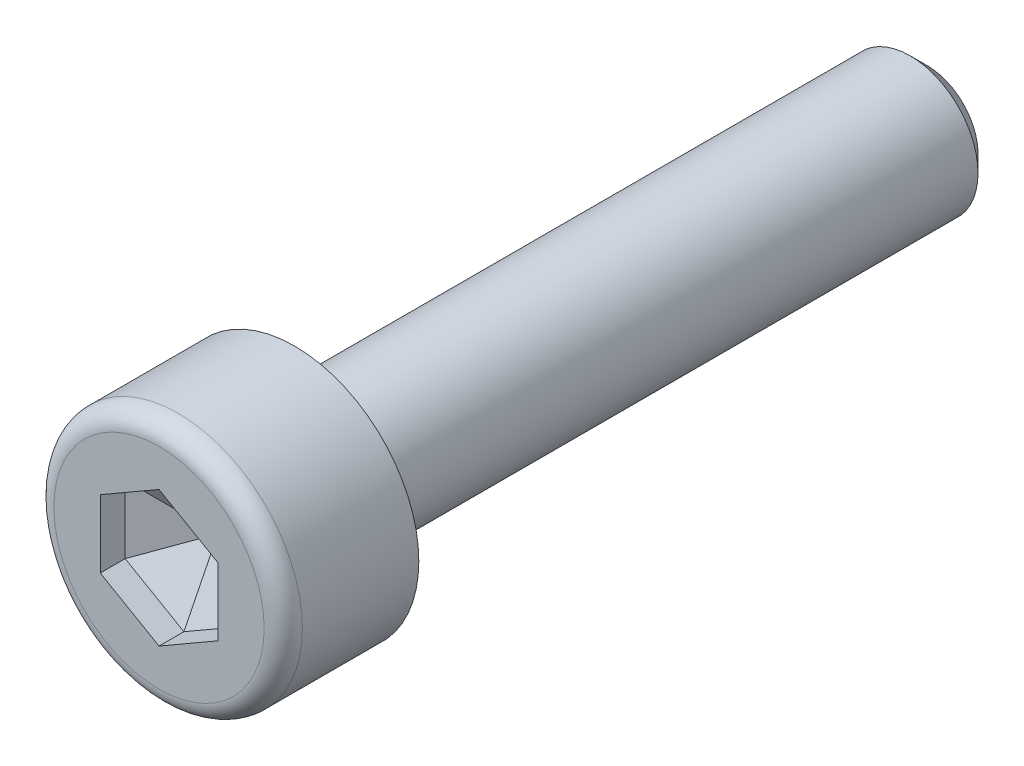
ISO-10303-21;
HEADER;
FILE_DESCRIPTION(('STEP AP214'),'2;1');
FILE_NAME('part.step','',(''),(''),'','','');
FILE_SCHEMA(('AUTOMOTIVE_DESIGN { 1 0 10303 214 1 1 1 1 }'));
ENDSEC;
DATA;
#1=APPLICATION_CONTEXT('core data for automotive mechanical design processes');
#2=APPLICATION_PROTOCOL_DEFINITION('international standard','automotive_design',2000,#1);
#3=PRODUCT_CONTEXT('',#1,'mechanical');
#4=PRODUCT('Part','Part','',(#3));
#5=PRODUCT_RELATED_PRODUCT_CATEGORY('part','',(#4));
#6=PRODUCT_DEFINITION_FORMATION('','',#4);
#7=PRODUCT_DEFINITION_CONTEXT('part definition',#1,'design');
#8=PRODUCT_DEFINITION('design','',#6,#7);
#9=PRODUCT_DEFINITION_SHAPE('','',#8);
#10=(LENGTH_UNIT() NAMED_UNIT(*) SI_UNIT(.MILLI.,.METRE.));
#11=(NAMED_UNIT(*) PLANE_ANGLE_UNIT() SI_UNIT($,.RADIAN.));
#12=(NAMED_UNIT(*) SI_UNIT($,.STERADIAN.) SOLID_ANGLE_UNIT());
#13=UNCERTAINTY_MEASURE_WITH_UNIT(LENGTH_MEASURE(1.E-05),#10,'distance_accuracy_value','');
#14=(GEOMETRIC_REPRESENTATION_CONTEXT(3) GLOBAL_UNCERTAINTY_ASSIGNED_CONTEXT((#13)) GLOBAL_UNIT_ASSIGNED_CONTEXT((#10,
#11,#12)) REPRESENTATION_CONTEXT('',''));
#15=CARTESIAN_POINT('',(0.,0.,0.));
#16=DIRECTION('',(0.,0.,1.));
#17=DIRECTION('',(1.,0.,0.));
#18=AXIS2_PLACEMENT_3D('',#15,#16,#17);
#19=CARTESIAN_POINT('',(0.,0.,0.));
#20=DIRECTION('',(0.,0.,1.));
#21=DIRECTION('',(1.,0.,0.));
#22=AXIS2_PLACEMENT_3D('',#19,#20,#21);
#23=PLANE('',#22);
#24=CARTESIAN_POINT('',(0.,0.,0.));
#25=DIRECTION('',(0.,0.,1.));
#26=DIRECTION('',(1.,0.,0.));
#27=AXIS2_PLACEMENT_3D('',#24,#25,#26);
#28=CIRCLE('',#27,1.6);
#29=CARTESIAN_POINT('',(1.6,0.,0.));
#30=VERTEX_POINT('',#29);
#31=EDGE_CURVE('E11',#30,#30,#28,.T.);
#32=ORIENTED_EDGE('',*,*,#31,.T.);
#33=EDGE_LOOP('',(#32));
#34=FACE_BOUND('',#33,.T.);
#35=CARTESIAN_POINT('',(0.,0.,0.));
#36=DIRECTION('',(0.,0.,1.));
#37=DIRECTION('',(1.,0.,0.));
#38=AXIS2_PLACEMENT_3D('',#35,#36,#37);
#39=CIRCLE('',#38,2.75);
#40=CARTESIAN_POINT('',(2.75,0.,0.));
#41=VERTEX_POINT('',#40);
#42=EDGE_CURVE('E154',#41,#41,#39,.T.);
#43=ORIENTED_EDGE('',*,*,#42,.F.);
#44=EDGE_LOOP('',(#43));
#45=FACE_BOUND('',#44,.T.);
#46=ADVANCED_FACE('F44',(#34,#45),#23,.F.);
#47=CARTESIAN_POINT('',(0.,0.,3.));
#48=DIRECTION('',(0.,0.,-1.));
#49=DIRECTION('',(-1.,0.,0.));
#50=AXIS2_PLACEMENT_3D('',#47,#48,#49);
#51=CYLINDRICAL_SURFACE('',#50,2.75);
#52=CARTESIAN_POINT('',(0.,0.,2.57692307692308));
#53=DIRECTION('',(0.,0.,1.));
#54=DIRECTION('',(1.,0.,0.));
#55=AXIS2_PLACEMENT_3D('',#52,#53,#54);
#56=CIRCLE('',#55,2.75);
#57=CARTESIAN_POINT('',(2.75,0.,2.57692307692308));
#58=VERTEX_POINT('',#57);
#59=EDGE_CURVE('E173',#58,#58,#56,.F.);
#60=ORIENTED_EDGE('',*,*,#59,.T.);
#61=EDGE_LOOP('',(#60));
#62=FACE_BOUND('',#61,.T.);
#63=ORIENTED_EDGE('',*,*,#42,.T.);
#64=EDGE_LOOP('',(#63));
#65=FACE_BOUND('',#64,.T.);
#66=ADVANCED_FACE('F235',(#62,#65),#51,.T.);
#67=CARTESIAN_POINT('',(0.,0.,3.));
#68=DIRECTION('',(0.,0.,1.));
#69=DIRECTION('',(1.,0.,0.));
#70=AXIS2_PLACEMENT_3D('',#67,#68,#69);
#71=PLANE('',#70);
#72=CARTESIAN_POINT('',(0.,0.,3.));
#73=DIRECTION('',(0.,0.,1.));
#74=DIRECTION('',(1.,0.,0.));
#75=AXIS2_PLACEMENT_3D('',#72,#73,#74);
#76=CIRCLE('',#75,2.32692307692308);
#77=CARTESIAN_POINT('',(2.32692307692308,0.,3.));
#78=VERTEX_POINT('',#77);
#79=EDGE_CURVE('E167',#78,#78,#76,.T.);
#80=ORIENTED_EDGE('',*,*,#79,.T.);
#81=EDGE_LOOP('',(#80));
#82=FACE_BOUND('',#81,.T.);
#83=DIRECTION('',(0.,1.,0.));
#84=VECTOR('',#83,1.);
#85=CARTESIAN_POINT('',(1.3,-0.750555349946514,3.));
#86=LINE('',#85,#84);
#87=CARTESIAN_POINT('',(1.3,-0.750555349946514,3.));
#88=VERTEX_POINT('',#87);
#89=CARTESIAN_POINT('',(1.3,0.750555349946514,3.));
#90=VERTEX_POINT('',#89);
#91=EDGE_CURVE('E140',#88,#90,#86,.T.);
#92=ORIENTED_EDGE('',*,*,#91,.F.);
#93=DIRECTION('',(0.866025403784439,0.5,0.));
#94=VECTOR('',#93,1.);
#95=CARTESIAN_POINT('',(0.,-1.50111069989303,3.));
#96=LINE('',#95,#94);
#97=CARTESIAN_POINT('',(0.,-1.50111069989303,3.));
#98=VERTEX_POINT('',#97);
#99=EDGE_CURVE('E149',#98,#88,#96,.T.);
#100=ORIENTED_EDGE('',*,*,#99,.F.);
#101=DIRECTION('',(0.866025403784439,-0.5,0.));
#102=VECTOR('',#101,1.);
#103=CARTESIAN_POINT('',(-1.3,-0.750555349946513,3.));
#104=LINE('',#103,#102);
#105=CARTESIAN_POINT('',(-1.3,-0.750555349946513,3.));
#106=VERTEX_POINT('',#105);
#107=EDGE_CURVE('E144',#106,#98,#104,.T.);
#108=ORIENTED_EDGE('',*,*,#107,.F.);
#109=DIRECTION('',(0.,-1.,0.));
#110=VECTOR('',#109,1.);
#111=CARTESIAN_POINT('',(-1.3,0.750555349946514,3.));
#112=LINE('',#111,#110);
#113=CARTESIAN_POINT('',(-1.3,0.750555349946514,3.));
#114=VERTEX_POINT('',#113);
#115=EDGE_CURVE('E145',#114,#106,#112,.T.);
#116=ORIENTED_EDGE('',*,*,#115,.F.);
#117=DIRECTION('',(-0.866025403784439,-0.5,0.));
#118=VECTOR('',#117,1.);
#119=CARTESIAN_POINT('',(0.,1.50111069989303,3.));
#120=LINE('',#119,#118);
#121=CARTESIAN_POINT('',(0.,1.50111069989303,3.));
#122=VERTEX_POINT('',#121);
#123=EDGE_CURVE('E125',#122,#114,#120,.T.);
#124=ORIENTED_EDGE('',*,*,#123,.F.);
#125=DIRECTION('',(-0.866025403784439,0.5,0.));
#126=VECTOR('',#125,1.);
#127=CARTESIAN_POINT('',(1.3,0.750555349946514,3.));
#128=LINE('',#127,#126);
#129=EDGE_CURVE('E135',#90,#122,#128,.T.);
#130=ORIENTED_EDGE('',*,*,#129,.F.);
#131=EDGE_LOOP('',(#92,#100,#108,#116,#124,#130));
#132=FACE_BOUND('',#131,.T.);
#133=ADVANCED_FACE('F137',(#82,#132),#71,.T.);
#134=CARTESIAN_POINT('',(1.3,-0.750555349946514,1.7));
#135=DIRECTION('',(1.,0.,0.));
#136=DIRECTION('',(0.,1.,0.));
#137=AXIS2_PLACEMENT_3D('',#134,#135,#136);
#138=PLANE('',#137);
#139=DIRECTION('',(0.,0.,1.));
#140=VECTOR('',#139,1.);
#141=CARTESIAN_POINT('',(1.3,0.750555349946514,1.7));
#142=LINE('',#141,#140);
#143=CARTESIAN_POINT('',(1.3,0.750555349946514,2.4492795389049));
#144=VERTEX_POINT('',#143);
#145=EDGE_CURVE('E127',#144,#90,#142,.T.);
#146=ORIENTED_EDGE('',*,*,#145,.F.);
#147=DIRECTION('',(0.,-1.,0.));
#148=VECTOR('',#147,1.);
#149=CARTESIAN_POINT('',(1.3,-0.750555349946514,2.4492795389049));
#150=LINE('',#149,#148);
#151=CARTESIAN_POINT('',(1.3,-0.750555349946514,2.4492795389049));
#152=VERTEX_POINT('',#151);
#153=EDGE_CURVE('E67',#144,#152,#150,.T.);
#154=ORIENTED_EDGE('',*,*,#153,.T.);
#155=DIRECTION('',(0.,0.,1.));
#156=VECTOR('',#155,1.);
#157=CARTESIAN_POINT('',(1.3,-0.750555349946514,1.7));
#158=LINE('',#157,#156);
#159=EDGE_CURVE('E152',#152,#88,#158,.T.);
#160=ORIENTED_EDGE('',*,*,#159,.T.);
#161=ORIENTED_EDGE('',*,*,#91,.T.);
#162=EDGE_LOOP('',(#146,#154,#160,#161));
#163=FACE_BOUND('',#162,.T.);
#164=ADVANCED_FACE('F292',(#163),#138,.F.);
#165=CARTESIAN_POINT('',(0.,-1.50111069989303,1.7));
#166=DIRECTION('',(0.5,-0.866025403784439,0.));
#167=DIRECTION('',(0.866025403784439,0.5,0.));
#168=AXIS2_PLACEMENT_3D('',#165,#166,#167);
#169=PLANE('',#168);
#170=ORIENTED_EDGE('',*,*,#159,.F.);
#171=DIRECTION('',(-0.866025403784439,-0.5,0.));
#172=VECTOR('',#171,1.);
#173=CARTESIAN_POINT('',(0.,-1.50111069989303,2.4492795389049));
#174=LINE('',#173,#172);
#175=CARTESIAN_POINT('',(0.,-1.50111069989303,2.4492795389049));
#176=VERTEX_POINT('',#175);
#177=EDGE_CURVE('E58',#152,#176,#174,.T.);
#178=ORIENTED_EDGE('',*,*,#177,.T.);
#179=DIRECTION('',(0.,0.,1.));
#180=VECTOR('',#179,1.);
#181=CARTESIAN_POINT('',(0.,-1.50111069989303,1.7));
#182=LINE('',#181,#180);
#183=EDGE_CURVE('E156',#176,#98,#182,.T.);
#184=ORIENTED_EDGE('',*,*,#183,.T.);
#185=ORIENTED_EDGE('',*,*,#99,.T.);
#186=EDGE_LOOP('',(#170,#178,#184,#185));
#187=FACE_BOUND('',#186,.T.);
#188=ADVANCED_FACE('F295',(#187),#169,.F.);
#189=CARTESIAN_POINT('',(-1.3,-0.750555349946513,1.7));
#190=DIRECTION('',(-0.5,-0.866025403784439,0.));
#191=DIRECTION('',(0.866025403784439,-0.5,0.));
#192=AXIS2_PLACEMENT_3D('',#189,#190,#191);
#193=PLANE('',#192);
#194=ORIENTED_EDGE('',*,*,#183,.F.);
#195=DIRECTION('',(-0.866025403784439,0.5,0.));
#196=VECTOR('',#195,1.);
#197=CARTESIAN_POINT('',(-1.3,-0.750555349946513,2.4492795389049));
#198=LINE('',#197,#196);
#199=CARTESIAN_POINT('',(-1.3,-0.750555349946513,2.4492795389049));
#200=VERTEX_POINT('',#199);
#201=EDGE_CURVE('E196',#176,#200,#198,.T.);
#202=ORIENTED_EDGE('',*,*,#201,.T.);
#203=DIRECTION('',(0.,0.,1.));
#204=VECTOR('',#203,1.);
#205=CARTESIAN_POINT('',(-1.3,-0.750555349946513,1.7));
#206=LINE('',#205,#204);
#207=EDGE_CURVE('E158',#200,#106,#206,.T.);
#208=ORIENTED_EDGE('',*,*,#207,.T.);
#209=ORIENTED_EDGE('',*,*,#107,.T.);
#210=EDGE_LOOP('',(#194,#202,#208,#209));
#211=FACE_BOUND('',#210,.T.);
#212=ADVANCED_FACE('F282',(#211),#193,.F.);
#213=CARTESIAN_POINT('',(-1.3,0.750555349946514,1.7));
#214=DIRECTION('',(-1.,0.,0.));
#215=DIRECTION('',(0.,0.,1.));
#216=AXIS2_PLACEMENT_3D('',#213,#214,#215);
#217=PLANE('',#216);
#218=ORIENTED_EDGE('',*,*,#207,.F.);
#219=DIRECTION('',(0.,1.,0.));
#220=VECTOR('',#219,1.);
#221=CARTESIAN_POINT('',(-1.3,0.750555349946514,2.4492795389049));
#222=LINE('',#221,#220);
#223=CARTESIAN_POINT('',(-1.3,0.750555349946514,2.4492795389049));
#224=VERTEX_POINT('',#223);
#225=EDGE_CURVE('E186',#200,#224,#222,.T.);
#226=ORIENTED_EDGE('',*,*,#225,.T.);
#227=DIRECTION('',(0.,0.,1.));
#228=VECTOR('',#227,1.);
#229=CARTESIAN_POINT('',(-1.3,0.750555349946514,1.7));
#230=LINE('',#229,#228);
#231=EDGE_CURVE('E126',#224,#114,#230,.T.);
#232=ORIENTED_EDGE('',*,*,#231,.T.);
#233=ORIENTED_EDGE('',*,*,#115,.T.);
#234=EDGE_LOOP('',(#218,#226,#232,#233));
#235=FACE_BOUND('',#234,.T.);
#236=ADVANCED_FACE('F286',(#235),#217,.F.);
#237=CARTESIAN_POINT('',(0.,1.50111069989303,1.7));
#238=DIRECTION('',(-0.5,0.866025403784439,0.));
#239=DIRECTION('',(-0.866025403784439,-0.5,0.));
#240=AXIS2_PLACEMENT_3D('',#237,#238,#239);
#241=PLANE('',#240);
#242=ORIENTED_EDGE('',*,*,#231,.F.);
#243=DIRECTION('',(0.866025403784439,0.5,0.));
#244=VECTOR('',#243,1.);
#245=CARTESIAN_POINT('',(0.,1.50111069989303,2.4492795389049));
#246=LINE('',#245,#244);
#247=CARTESIAN_POINT('',(0.,1.50111069989303,2.4492795389049));
#248=VERTEX_POINT('',#247);
#249=EDGE_CURVE('E123',#224,#248,#246,.T.);
#250=ORIENTED_EDGE('',*,*,#249,.T.);
#251=DIRECTION('',(0.,0.,1.));
#252=VECTOR('',#251,1.);
#253=CARTESIAN_POINT('',(0.,1.50111069989303,1.7));
#254=LINE('',#253,#252);
#255=EDGE_CURVE('E120',#248,#122,#254,.T.);
#256=ORIENTED_EDGE('',*,*,#255,.T.);
#257=ORIENTED_EDGE('',*,*,#123,.T.);
#258=EDGE_LOOP('',(#242,#250,#256,#257));
#259=FACE_BOUND('',#258,.T.);
#260=ADVANCED_FACE('F119',(#259),#241,.F.);
#261=CARTESIAN_POINT('',(1.3,0.750555349946514,1.7));
#262=DIRECTION('',(0.5,0.866025403784439,0.));
#263=DIRECTION('',(-0.866025403784439,0.5,0.));
#264=AXIS2_PLACEMENT_3D('',#261,#262,#263);
#265=PLANE('',#264);
#266=ORIENTED_EDGE('',*,*,#255,.F.);
#267=DIRECTION('',(0.866025403784439,-0.5,0.));
#268=VECTOR('',#267,1.);
#269=CARTESIAN_POINT('',(1.3,0.750555349946514,2.4492795389049));
#270=LINE('',#269,#268);
#271=EDGE_CURVE('E191',#248,#144,#270,.T.);
#272=ORIENTED_EDGE('',*,*,#271,.T.);
#273=ORIENTED_EDGE('',*,*,#145,.T.);
#274=ORIENTED_EDGE('',*,*,#129,.T.);
#275=EDGE_LOOP('',(#266,#272,#273,#274));
#276=FACE_BOUND('',#275,.T.);
#277=ADVANCED_FACE('F132',(#276),#265,.F.);
#278=CARTESIAN_POINT('',(0.,0.,1.7));
#279=DIRECTION('',(0.,0.,1.));
#280=DIRECTION('',(1.,0.,0.));
#281=AXIS2_PLACEMENT_3D('',#278,#279,#280);
#282=PLANE('',#281);
#283=DIRECTION('',(-0.866025403784439,-0.5,0.));
#284=VECTOR('',#283,1.);
#285=CARTESIAN_POINT('',(-0.00110488477245846,0.00191371656240723,1.7));
#286=LINE('',#285,#284);
#287=CARTESIAN_POINT('',(0.,0.00255162208320922,1.7));
#288=VERTEX_POINT('',#287);
#289=CARTESIAN_POINT('',(-0.00220976954491692,0.00127581104160482,1.7));
#290=VERTEX_POINT('',#289);
#291=EDGE_CURVE('E183',#288,#290,#286,.T.);
#292=ORIENTED_EDGE('',*,*,#291,.T.);
#293=DIRECTION('',(0.,-1.,0.));
#294=VECTOR('',#293,1.);
#295=CARTESIAN_POINT('',(-0.00220976954491692,0.,1.7));
#296=LINE('',#295,#294);
#297=CARTESIAN_POINT('',(-0.00220976954491692,-0.00127581104160444,1.7));
#298=VERTEX_POINT('',#297);
#299=EDGE_CURVE('E187',#290,#298,#296,.T.);
#300=ORIENTED_EDGE('',*,*,#299,.T.);
#301=DIRECTION('',(0.866025403784439,-0.5,0.));
#302=VECTOR('',#301,1.);
#303=CARTESIAN_POINT('',(-0.0011048847724583,-0.00191371656240695,1.7));
#304=LINE('',#303,#302);
#305=CARTESIAN_POINT('',(0.,-0.00255162208320926,1.7));
#306=VERTEX_POINT('',#305);
#307=EDGE_CURVE('E178',#298,#306,#304,.T.);
#308=ORIENTED_EDGE('',*,*,#307,.T.);
#309=DIRECTION('',(0.866025403784439,0.5,0.));
#310=VECTOR('',#309,1.);
#311=CARTESIAN_POINT('',(0.0011048847724583,-0.00191371656240695,1.7));
#312=LINE('',#311,#310);
#313=CARTESIAN_POINT('',(0.00220976954491684,-0.00127581104160452,1.7));
#314=VERTEX_POINT('',#313);
#315=EDGE_CURVE('E176',#306,#314,#312,.T.);
#316=ORIENTED_EDGE('',*,*,#315,.T.);
#317=DIRECTION('',(0.,1.,0.));
#318=VECTOR('',#317,1.);
#319=CARTESIAN_POINT('',(0.00220976954491681,0.,1.7));
#320=LINE('',#319,#318);
#321=CARTESIAN_POINT('',(0.00220976954491681,0.00127581104160407,1.7));
#322=VERTEX_POINT('',#321);
#323=EDGE_CURVE('E179',#314,#322,#320,.T.);
#324=ORIENTED_EDGE('',*,*,#323,.T.);
#325=DIRECTION('',(-0.866025403784439,0.5,0.));
#326=VECTOR('',#325,1.);
#327=CARTESIAN_POINT('',(0.00110488477245811,0.00191371656240662,1.7));
#328=LINE('',#327,#326);
#329=EDGE_CURVE('E185',#322,#288,#328,.T.);
#330=ORIENTED_EDGE('',*,*,#329,.T.);
#331=EDGE_LOOP('',(#292,#300,#308,#316,#324,#330));
#332=FACE_BOUND('',#331,.T.);
#333=ADVANCED_FACE('F303',(#332),#282,.T.);
#334=CARTESIAN_POINT('',(0.,0.,-14.));
#335=DIRECTION('',(0.,0.,1.));
#336=DIRECTION('',(1.,0.,0.));
#337=AXIS2_PLACEMENT_3D('',#334,#335,#336);
#338=CYLINDRICAL_SURFACE('',#337,1.5);
#339=CARTESIAN_POINT('',(0.,0.,-0.0999999999999994));
#340=DIRECTION('',(0.,0.,1.));
#341=DIRECTION('',(1.,0.,0.));
#342=AXIS2_PLACEMENT_3D('',#339,#340,#341);
#343=CIRCLE('',#342,1.5);
#344=CARTESIAN_POINT('',(1.5,0.,-0.0999999999999994));
#345=VERTEX_POINT('',#344);
#346=EDGE_CURVE('E52',#345,#345,#343,.F.);
#347=ORIENTED_EDGE('',*,*,#346,.T.);
#348=EDGE_LOOP('',(#347));
#349=FACE_BOUND('',#348,.T.);
#350=CARTESIAN_POINT('',(0.,0.,-13.625));
#351=DIRECTION('',(0.,0.,-1.));
#352=DIRECTION('',(-1.,0.,0.));
#353=AXIS2_PLACEMENT_3D('',#350,#351,#352);
#354=CIRCLE('',#353,1.5);
#355=CARTESIAN_POINT('',(-1.5,0.,-13.625));
#356=VERTEX_POINT('',#355);
#357=EDGE_CURVE('E170',#356,#356,#354,.F.);
#358=ORIENTED_EDGE('',*,*,#357,.T.);
#359=EDGE_LOOP('',(#358));
#360=FACE_BOUND('',#359,.T.);
#361=ADVANCED_FACE('F220',(#349,#360),#338,.T.);
#362=CARTESIAN_POINT('',(0.,0.,-14.));
#363=DIRECTION('',(0.,0.,-1.));
#364=DIRECTION('',(-1.,0.,0.));
#365=AXIS2_PLACEMENT_3D('',#362,#363,#364);
#366=PLANE('',#365);
#367=CARTESIAN_POINT('',(0.,0.,-14.));
#368=DIRECTION('',(0.,0.,-1.));
#369=DIRECTION('',(-1.,0.,0.));
#370=AXIS2_PLACEMENT_3D('',#367,#368,#369);
#371=CIRCLE('',#370,1.125);
#372=CARTESIAN_POINT('',(-1.125,0.,-14.));
#373=VERTEX_POINT('',#372);
#374=EDGE_CURVE('E165',#373,#373,#371,.T.);
#375=ORIENTED_EDGE('',*,*,#374,.T.);
#376=EDGE_LOOP('',(#375));
#377=FACE_BOUND('',#376,.T.);
#378=ADVANCED_FACE('F247',(#377),#366,.T.);
#379=CARTESIAN_POINT('',(0.,0.,-14.));
#380=DIRECTION('',(0.,0.,1.));
#381=DIRECTION('',(1.,0.,0.));
#382=AXIS2_PLACEMENT_3D('',#379,#380,#381);
#383=CONICAL_SURFACE('',#382,1.125,0.785398163397447);
#384=ORIENTED_EDGE('',*,*,#357,.F.);
#385=EDGE_LOOP('',(#384));
#386=FACE_BOUND('',#385,.T.);
#387=ORIENTED_EDGE('',*,*,#374,.F.);
#388=EDGE_LOOP('',(#387));
#389=FACE_BOUND('',#388,.T.);
#390=ADVANCED_FACE('F242',(#386,#389),#383,.T.);
#391=CARTESIAN_POINT('',(0.,0.,2.57692307692308));
#392=DIRECTION('',(0.,0.,1.));
#393=DIRECTION('',(1.,0.,0.));
#394=AXIS2_PLACEMENT_3D('',#391,#392,#393);
#395=TOROIDAL_SURFACE('',#394,2.32692307692308,0.423076923076923);
#396=ORIENTED_EDGE('',*,*,#59,.F.);
#397=EDGE_LOOP('',(#396));
#398=FACE_BOUND('',#397,.T.);
#399=ORIENTED_EDGE('',*,*,#79,.F.);
#400=EDGE_LOOP('',(#399));
#401=FACE_BOUND('',#400,.T.);
#402=ADVANCED_FACE('F250',(#398,#401),#395,.T.);
#403=CARTESIAN_POINT('',(0.00220976954491681,0.,1.7));
#404=DIRECTION('',(0.499999999999995,0.,-0.866025403784442));
#405=DIRECTION('',(0.,1.,0.));
#406=AXIS2_PLACEMENT_3D('',#403,#404,#405);
#407=PLANE('',#406);
#408=DIRECTION('',(-0.774596669241485,0.44721359549996,-0.447213595499953));
#409=VECTOR('',#408,1.);
#410=CARTESIAN_POINT('',(0.00176781563593351,-0.00102064883328365,1.69974483779168));
#411=LINE('',#410,#409);
#412=EDGE_CURVE('E209',#152,#314,#411,.T.);
#413=ORIENTED_EDGE('',*,*,#412,.F.);
#414=ORIENTED_EDGE('',*,*,#153,.F.);
#415=DIRECTION('',(-0.774596669241485,-0.44721359549996,-0.447213595499953));
#416=VECTOR('',#415,1.);
#417=CARTESIAN_POINT('',(0.00176781563593333,0.00102064883328305,1.69974483779168));
#418=LINE('',#417,#416);
#419=EDGE_CURVE('E215',#322,#144,#418,.F.);
#420=ORIENTED_EDGE('',*,*,#419,.F.);
#421=ORIENTED_EDGE('',*,*,#323,.F.);
#422=EDGE_LOOP('',(#413,#414,#420,#421));
#423=FACE_BOUND('',#422,.T.);
#424=ADVANCED_FACE('F252',(#423),#407,.F.);
#425=CARTESIAN_POINT('',(0.00110488477245811,0.00191371656240662,1.7));
#426=DIRECTION('',(0.249999999999997,0.433012701892215,-0.866025403784442));
#427=DIRECTION('',(-0.866025403784439,0.5,0.));
#428=AXIS2_PLACEMENT_3D('',#425,#426,#427);
#429=PLANE('',#428);
#430=ORIENTED_EDGE('',*,*,#419,.T.);
#431=ORIENTED_EDGE('',*,*,#271,.F.);
#432=DIRECTION('',(0.,-0.894427190999918,-0.447213595499953));
#433=VECTOR('',#432,1.);
#434=CARTESIAN_POINT('',(0.,0.00204129766656763,1.69974483779168));
#435=LINE('',#434,#433);
#436=EDGE_CURVE('E207',#288,#248,#435,.F.);
#437=ORIENTED_EDGE('',*,*,#436,.F.);
#438=ORIENTED_EDGE('',*,*,#329,.F.);
#439=EDGE_LOOP('',(#430,#431,#437,#438));
#440=FACE_BOUND('',#439,.T.);
#441=ADVANCED_FACE('F263',(#440),#429,.F.);
#442=CARTESIAN_POINT('',(0.00110488477245832,-0.00191371656240699,1.7));
#443=DIRECTION('',(0.249999999999997,-0.433012701892215,-0.866025403784442));
#444=DIRECTION('',(0.866025403784439,0.5,0.));
#445=AXIS2_PLACEMENT_3D('',#442,#443,#444);
#446=PLANE('',#445);
#447=ORIENTED_EDGE('',*,*,#412,.T.);
#448=ORIENTED_EDGE('',*,*,#315,.F.);
#449=DIRECTION('',(0.,-0.894427190999918,0.447213595499953));
#450=VECTOR('',#449,1.);
#451=CARTESIAN_POINT('',(0.,-0.00204129766656746,1.69974483779168));
#452=LINE('',#451,#450);
#453=EDGE_CURVE('E203',#176,#306,#452,.F.);
#454=ORIENTED_EDGE('',*,*,#453,.F.);
#455=ORIENTED_EDGE('',*,*,#177,.F.);
#456=EDGE_LOOP('',(#447,#448,#454,#455));
#457=FACE_BOUND('',#456,.T.);
#458=ADVANCED_FACE('F259',(#457),#446,.F.);
#459=CARTESIAN_POINT('',(-0.00110488477245846,0.00191371656240723,1.7));
#460=DIRECTION('',(-0.249999999999997,0.433012701892215,-0.866025403784442));
#461=DIRECTION('',(-0.866025403784439,-0.5,0.));
#462=AXIS2_PLACEMENT_3D('',#459,#460,#461);
#463=PLANE('',#462);
#464=ORIENTED_EDGE('',*,*,#436,.T.);
#465=ORIENTED_EDGE('',*,*,#249,.F.);
#466=DIRECTION('',(0.774596669241485,-0.44721359549996,-0.447213595499953));
#467=VECTOR('',#466,1.);
#468=CARTESIAN_POINT('',(-0.00176781563593353,0.00102064883328385,1.69974483779168));
#469=LINE('',#468,#467);
#470=EDGE_CURVE('E201',#290,#224,#469,.F.);
#471=ORIENTED_EDGE('',*,*,#470,.F.);
#472=ORIENTED_EDGE('',*,*,#291,.F.);
#473=EDGE_LOOP('',(#464,#465,#471,#472));
#474=FACE_BOUND('',#473,.T.);
#475=ADVANCED_FACE('F258',(#474),#463,.F.);
#476=CARTESIAN_POINT('',(-0.00110488477245832,-0.00191371656240699,1.7));
#477=DIRECTION('',(-0.249999999999997,-0.433012701892215,-0.866025403784442));
#478=DIRECTION('',(0.866025403784439,-0.5,0.));
#479=AXIS2_PLACEMENT_3D('',#476,#477,#478);
#480=PLANE('',#479);
#481=ORIENTED_EDGE('',*,*,#453,.T.);
#482=ORIENTED_EDGE('',*,*,#307,.F.);
#483=DIRECTION('',(-0.774596669241486,-0.447213595499959,0.447213595499953));
#484=VECTOR('',#483,1.);
#485=CARTESIAN_POINT('',(-0.00176781563593364,-0.0010206488332836,1.69974483779168));
#486=LINE('',#485,#484);
#487=EDGE_CURVE('E198',#200,#298,#486,.F.);
#488=ORIENTED_EDGE('',*,*,#487,.F.);
#489=ORIENTED_EDGE('',*,*,#201,.F.);
#490=EDGE_LOOP('',(#481,#482,#488,#489));
#491=FACE_BOUND('',#490,.T.);
#492=ADVANCED_FACE('F227',(#491),#480,.F.);
#493=CARTESIAN_POINT('',(-0.00220976954491692,0.,1.7));
#494=DIRECTION('',(-0.499999999999995,0.,-0.866025403784442));
#495=DIRECTION('',(0.,-1.,0.));
#496=AXIS2_PLACEMENT_3D('',#493,#494,#495);
#497=PLANE('',#496);
#498=ORIENTED_EDGE('',*,*,#470,.T.);
#499=ORIENTED_EDGE('',*,*,#225,.F.);
#500=ORIENTED_EDGE('',*,*,#487,.T.);
#501=ORIENTED_EDGE('',*,*,#299,.F.);
#502=EDGE_LOOP('',(#498,#499,#500,#501));
#503=FACE_BOUND('',#502,.T.);
#504=ADVANCED_FACE('F221',(#503),#497,.F.);
#505=CARTESIAN_POINT('',(0.,0.,-0.0999999999999994));
#506=DIRECTION('',(0.,0.,1.));
#507=DIRECTION('',(1.,0.,0.));
#508=AXIS2_PLACEMENT_3D('',#505,#506,#507);
#509=TOROIDAL_SURFACE('',#508,1.6,0.1);
#510=ORIENTED_EDGE('',*,*,#31,.F.);
#511=EDGE_LOOP('',(#510));
#512=FACE_BOUND('',#511,.T.);
#513=ORIENTED_EDGE('',*,*,#346,.F.);
#514=EDGE_LOOP('',(#513));
#515=FACE_BOUND('',#514,.T.);
#516=ADVANCED_FACE('F50',(#512,#515),#509,.F.);
#517=CLOSED_SHELL('',(#46,#66,#133,#164,#188,#212,#236,#260,#277,#333,#361,#378,#390,#402,#424,
#441,#458,#475,#492,#504,#516));
#518=MANIFOLD_SOLID_BREP('B2',#517);
#519=ADVANCED_BREP_SHAPE_REPRESENTATION('',(#18,#518),#14);
#520=SHAPE_DEFINITION_REPRESENTATION(#9,#519);
ENDSEC;
END-ISO-10303-21;
